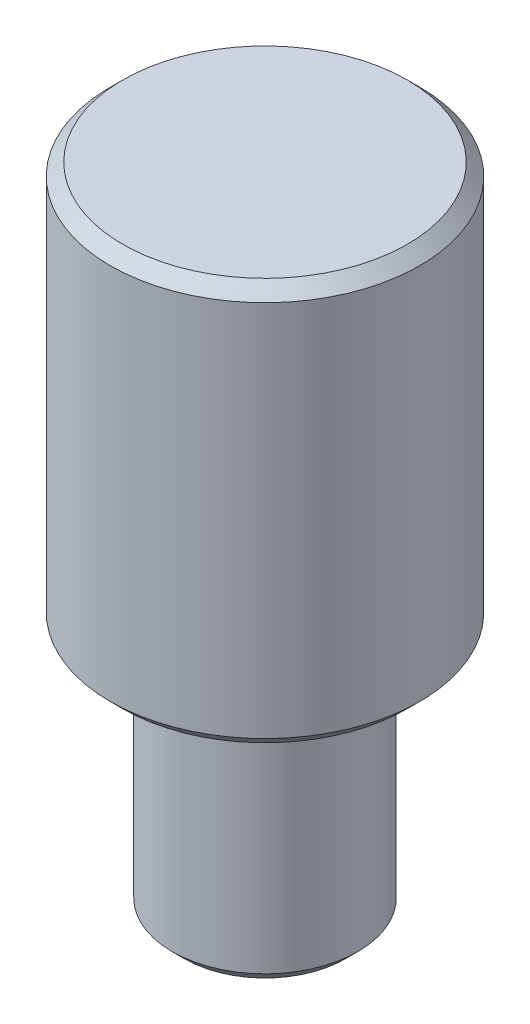
ISO-10303-21;
HEADER;
FILE_DESCRIPTION(('STEP AP214'),'2;1');
FILE_NAME('part.step','',(''),(''),'','','');
FILE_SCHEMA(('AUTOMOTIVE_DESIGN { 1 0 10303 214 1 1 1 1 }'));
ENDSEC;
DATA;
#1=APPLICATION_CONTEXT('core data for automotive mechanical design processes');
#2=APPLICATION_PROTOCOL_DEFINITION('international standard','automotive_design',2000,#1);
#3=PRODUCT_CONTEXT('',#1,'mechanical');
#4=PRODUCT('Part','Part','',(#3));
#5=PRODUCT_RELATED_PRODUCT_CATEGORY('part','',(#4));
#6=PRODUCT_DEFINITION_FORMATION('','',#4);
#7=PRODUCT_DEFINITION_CONTEXT('part definition',#1,'design');
#8=PRODUCT_DEFINITION('design','',#6,#7);
#9=PRODUCT_DEFINITION_SHAPE('','',#8);
#10=(LENGTH_UNIT() NAMED_UNIT(*) SI_UNIT(.MILLI.,.METRE.));
#11=(NAMED_UNIT(*) PLANE_ANGLE_UNIT() SI_UNIT($,.RADIAN.));
#12=(NAMED_UNIT(*) SI_UNIT($,.STERADIAN.) SOLID_ANGLE_UNIT());
#13=UNCERTAINTY_MEASURE_WITH_UNIT(LENGTH_MEASURE(1.E-05),#10,'distance_accuracy_value','');
#14=(GEOMETRIC_REPRESENTATION_CONTEXT(3) GLOBAL_UNCERTAINTY_ASSIGNED_CONTEXT((#13)) GLOBAL_UNIT_ASSIGNED_CONTEXT((#10,
#11,#12)) REPRESENTATION_CONTEXT('',''));
#15=CARTESIAN_POINT('',(0.,0.,0.));
#16=DIRECTION('',(0.,0.,1.));
#17=DIRECTION('',(1.,0.,0.));
#18=AXIS2_PLACEMENT_3D('',#15,#16,#17);
#19=CARTESIAN_POINT('',(0.,0.,0.));
#20=DIRECTION('',(0.,-1.,0.));
#21=DIRECTION('',(0.,0.,-1.));
#22=AXIS2_PLACEMENT_3D('',#19,#20,#21);
#23=PLANE('',#22);
#24=CARTESIAN_POINT('',(0.,0.,0.));
#25=DIRECTION('',(0.,-1.,0.));
#26=DIRECTION('',(0.,0.,-1.));
#27=AXIS2_PLACEMENT_3D('',#24,#25,#26);
#28=CIRCLE('',#27,23.);
#29=CARTESIAN_POINT('',(0.,0.,-23.));
#30=VERTEX_POINT('',#29);
#31=EDGE_CURVE('E10',#30,#30,#28,.F.);
#32=ORIENTED_EDGE('',*,*,#31,.T.);
#33=EDGE_LOOP('',(#32));
#34=FACE_BOUND('',#33,.T.);
#35=ADVANCED_FACE('F47',(#34),#23,.F.);
#36=CARTESIAN_POINT('',(0.,0.,0.));
#37=DIRECTION('',(0.,1.,0.));
#38=DIRECTION('',(0.,0.,1.));
#39=AXIS2_PLACEMENT_3D('',#36,#37,#38);
#40=CYLINDRICAL_SURFACE('',#39,25.);
#41=CARTESIAN_POINT('',(0.,-63.,0.));
#42=DIRECTION('',(0.,1.,0.));
#43=DIRECTION('',(0.,0.,1.));
#44=AXIS2_PLACEMENT_3D('',#41,#42,#43);
#45=CIRCLE('',#44,25.);
#46=CARTESIAN_POINT('',(0.,-63.,25.));
#47=VERTEX_POINT('',#46);
#48=EDGE_CURVE('E59',#47,#47,#45,.T.);
#49=ORIENTED_EDGE('',*,*,#48,.T.);
#50=EDGE_LOOP('',(#49));
#51=FACE_BOUND('',#50,.T.);
#52=CARTESIAN_POINT('',(0.,-2.00000000000001,0.));
#53=DIRECTION('',(0.,-1.,0.));
#54=DIRECTION('',(0.,0.,-1.));
#55=AXIS2_PLACEMENT_3D('',#52,#53,#54);
#56=CIRCLE('',#55,25.);
#57=CARTESIAN_POINT('',(0.,-2.00000000000001,-25.));
#58=VERTEX_POINT('',#57);
#59=EDGE_CURVE('E63',#58,#58,#56,.T.);
#60=ORIENTED_EDGE('',*,*,#59,.T.);
#61=EDGE_LOOP('',(#60));
#62=FACE_BOUND('',#61,.T.);
#63=ADVANCED_FACE('F92',(#51,#62),#40,.T.);
#64=CARTESIAN_POINT('',(25.,-65.,0.));
#65=DIRECTION('',(0.,1.,0.));
#66=DIRECTION('',(0.,0.,1.));
#67=AXIS2_PLACEMENT_3D('',#64,#65,#66);
#68=PLANE('',#67);
#69=CARTESIAN_POINT('',(0.,-65.,0.));
#70=DIRECTION('',(0.,1.,0.));
#71=DIRECTION('',(0.,0.,1.));
#72=AXIS2_PLACEMENT_3D('',#69,#70,#71);
#73=CIRCLE('',#72,23.);
#74=CARTESIAN_POINT('',(0.,-65.,23.));
#75=VERTEX_POINT('',#74);
#76=EDGE_CURVE('E55',#75,#75,#73,.F.);
#77=ORIENTED_EDGE('',*,*,#76,.T.);
#78=EDGE_LOOP('',(#77));
#79=FACE_BOUND('',#78,.T.);
#80=CARTESIAN_POINT('',(0.,-65.,0.));
#81=DIRECTION('',(0.,1.,0.));
#82=DIRECTION('',(0.,0.,1.));
#83=AXIS2_PLACEMENT_3D('',#80,#81,#82);
#84=CIRCLE('',#83,15.);
#85=CARTESIAN_POINT('',(0.,-65.,15.));
#86=VERTEX_POINT('',#85);
#87=EDGE_CURVE('E74',#86,#86,#84,.T.);
#88=ORIENTED_EDGE('',*,*,#87,.T.);
#89=EDGE_LOOP('',(#88));
#90=FACE_BOUND('',#89,.T.);
#91=ADVANCED_FACE('F78',(#79,#90),#68,.F.);
#92=CARTESIAN_POINT('',(0.,0.,0.));
#93=DIRECTION('',(0.,1.,0.));
#94=DIRECTION('',(0.,0.,1.));
#95=AXIS2_PLACEMENT_3D('',#92,#93,#94);
#96=CYLINDRICAL_SURFACE('',#95,15.);
#97=CARTESIAN_POINT('',(0.,-103.,0.));
#98=DIRECTION('',(0.,1.,0.));
#99=DIRECTION('',(0.,0.,1.));
#100=AXIS2_PLACEMENT_3D('',#97,#98,#99);
#101=CIRCLE('',#100,15.);
#102=CARTESIAN_POINT('',(0.,-103.,15.));
#103=VERTEX_POINT('',#102);
#104=EDGE_CURVE('E71',#103,#103,#101,.T.);
#105=ORIENTED_EDGE('',*,*,#104,.T.);
#106=EDGE_LOOP('',(#105));
#107=FACE_BOUND('',#106,.T.);
#108=ORIENTED_EDGE('',*,*,#87,.F.);
#109=EDGE_LOOP('',(#108));
#110=FACE_BOUND('',#109,.T.);
#111=ADVANCED_FACE('F80',(#107,#110),#96,.T.);
#112=CARTESIAN_POINT('',(15.,-105.,0.));
#113=DIRECTION('',(0.,1.,0.));
#114=DIRECTION('',(0.,0.,1.));
#115=AXIS2_PLACEMENT_3D('',#112,#113,#114);
#116=PLANE('',#115);
#117=CARTESIAN_POINT('',(0.,-105.,0.));
#118=DIRECTION('',(0.,1.,0.));
#119=DIRECTION('',(0.,0.,1.));
#120=AXIS2_PLACEMENT_3D('',#117,#118,#119);
#121=CIRCLE('',#120,13.);
#122=CARTESIAN_POINT('',(0.,-105.,13.));
#123=VERTEX_POINT('',#122);
#124=EDGE_CURVE('E68',#123,#123,#121,.F.);
#125=ORIENTED_EDGE('',*,*,#124,.T.);
#126=EDGE_LOOP('',(#125));
#127=FACE_BOUND('',#126,.T.);
#128=ADVANCED_FACE('F82',(#127),#116,.F.);
#129=CARTESIAN_POINT('',(0.,-103.,0.));
#130=DIRECTION('',(0.,1.,0.));
#131=DIRECTION('',(0.,0.,1.));
#132=AXIS2_PLACEMENT_3D('',#129,#130,#131);
#133=CONICAL_SURFACE('',#132,15.,0.785398163397451);
#134=ORIENTED_EDGE('',*,*,#124,.F.);
#135=EDGE_LOOP('',(#134));
#136=FACE_BOUND('',#135,.T.);
#137=ORIENTED_EDGE('',*,*,#104,.F.);
#138=EDGE_LOOP('',(#137));
#139=FACE_BOUND('',#138,.T.);
#140=ADVANCED_FACE('F88',(#136,#139),#133,.T.);
#141=CARTESIAN_POINT('',(0.,-63.,0.));
#142=DIRECTION('',(0.,1.,0.));
#143=DIRECTION('',(0.,0.,1.));
#144=AXIS2_PLACEMENT_3D('',#141,#142,#143);
#145=CONICAL_SURFACE('',#144,25.,0.785398163397454);
#146=ORIENTED_EDGE('',*,*,#76,.F.);
#147=EDGE_LOOP('',(#146));
#148=FACE_BOUND('',#147,.T.);
#149=ORIENTED_EDGE('',*,*,#48,.F.);
#150=EDGE_LOOP('',(#149));
#151=FACE_BOUND('',#150,.T.);
#152=ADVANCED_FACE('F108',(#148,#151),#145,.T.);
#153=CARTESIAN_POINT('',(0.,0.,0.));
#154=DIRECTION('',(0.,-1.,0.));
#155=DIRECTION('',(0.,0.,-1.));
#156=AXIS2_PLACEMENT_3D('',#153,#154,#155);
#157=CONICAL_SURFACE('',#156,23.,0.785398163397444);
#158=ORIENTED_EDGE('',*,*,#59,.F.);
#159=EDGE_LOOP('',(#158));
#160=FACE_BOUND('',#159,.T.);
#161=ORIENTED_EDGE('',*,*,#31,.F.);
#162=EDGE_LOOP('',(#161));
#163=FACE_BOUND('',#162,.T.);
#164=ADVANCED_FACE('F50',(#160,#163),#157,.T.);
#165=CLOSED_SHELL('',(#35,#63,#91,#111,#128,#140,#152,#164));
#166=MANIFOLD_SOLID_BREP('B2',#165);
#167=ADVANCED_BREP_SHAPE_REPRESENTATION('',(#18,#166),#14);
#168=SHAPE_DEFINITION_REPRESENTATION(#9,#167);
ENDSEC;
END-ISO-10303-21;
